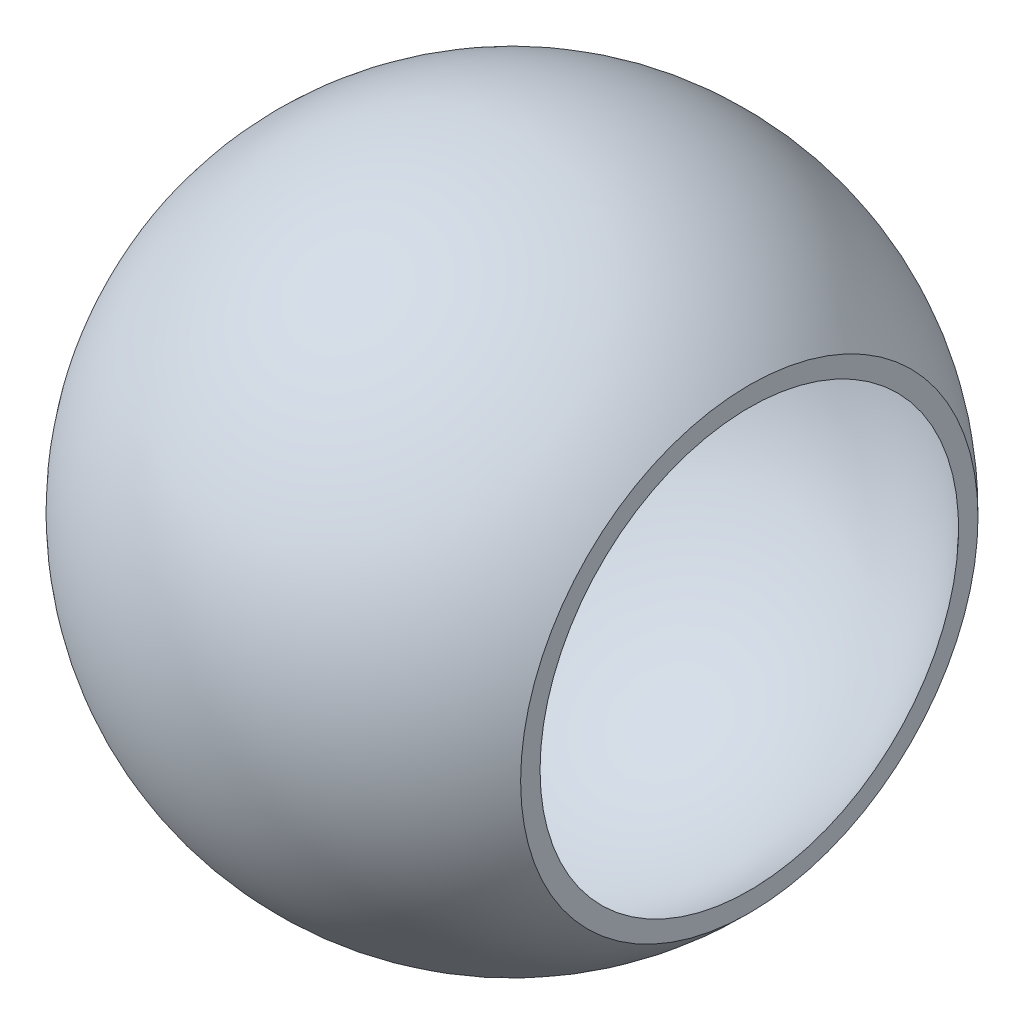
ISO-10303-21;
HEADER;
FILE_DESCRIPTION(('STEP AP214'),'2;1');
FILE_NAME('part.step','',(''),(''),'','','');
FILE_SCHEMA(('AUTOMOTIVE_DESIGN { 1 0 10303 214 1 1 1 1 }'));
ENDSEC;
DATA;
#1=APPLICATION_CONTEXT('core data for automotive mechanical design processes');
#2=APPLICATION_PROTOCOL_DEFINITION('international standard','automotive_design',2000,#1);
#3=PRODUCT_CONTEXT('',#1,'mechanical');
#4=PRODUCT('Part','Part','',(#3));
#5=PRODUCT_RELATED_PRODUCT_CATEGORY('part','',(#4));
#6=PRODUCT_DEFINITION_FORMATION('','',#4);
#7=PRODUCT_DEFINITION_CONTEXT('part definition',#1,'design');
#8=PRODUCT_DEFINITION('design','',#6,#7);
#9=PRODUCT_DEFINITION_SHAPE('','',#8);
#10=(LENGTH_UNIT() NAMED_UNIT(*) SI_UNIT(.MILLI.,.METRE.));
#11=(NAMED_UNIT(*) PLANE_ANGLE_UNIT() SI_UNIT($,.RADIAN.));
#12=(NAMED_UNIT(*) SI_UNIT($,.STERADIAN.) SOLID_ANGLE_UNIT());
#13=UNCERTAINTY_MEASURE_WITH_UNIT(LENGTH_MEASURE(1.E-05),#10,'distance_accuracy_value','');
#14=(GEOMETRIC_REPRESENTATION_CONTEXT(3) GLOBAL_UNCERTAINTY_ASSIGNED_CONTEXT((#13)) GLOBAL_UNIT_ASSIGNED_CONTEXT((#10,
#11,#12)) REPRESENTATION_CONTEXT('',''));
#15=CARTESIAN_POINT('',(0.,0.,0.));
#16=DIRECTION('',(0.,0.,1.));
#17=DIRECTION('',(1.,0.,0.));
#18=AXIS2_PLACEMENT_3D('',#15,#16,#17);
#19=CARTESIAN_POINT('',(0.,0.,0.));
#20=DIRECTION('',(-1.,0.,0.));
#21=DIRECTION('',(0.,1.,0.));
#22=AXIS2_PLACEMENT_3D('',#19,#20,#21);
#23=SPHERICAL_SURFACE('',#22,63.5);
#24=CARTESIAN_POINT('',(45.72,0.,0.));
#25=DIRECTION('',(-1.,0.,0.));
#26=DIRECTION('',(0.,0.,1.));
#27=AXIS2_PLACEMENT_3D('',#24,#25,#26);
#28=CIRCLE('',#27,44.0673529951596);
#29=CARTESIAN_POINT('',(45.72,0.,44.0673529951596));
#30=VERTEX_POINT('',#29);
#31=EDGE_CURVE('E53',#30,#30,#28,.T.);
#32=ORIENTED_EDGE('',*,*,#31,.T.);
#33=EDGE_LOOP('',(#32));
#34=FACE_BOUND('',#33,.T.);
#35=ADVANCED_FACE('F39',(#34),#23,.T.);
#36=CARTESIAN_POINT('',(0.,0.,0.));
#37=DIRECTION('',(-1.,0.,0.));
#38=DIRECTION('',(0.,-1.,0.));
#39=AXIS2_PLACEMENT_3D('',#36,#37,#38);
#40=SPHERICAL_SURFACE('',#39,60.96);
#41=CARTESIAN_POINT('',(-58.728190140881,-4.93898434507144,-15.5797213202183));
#42=CARTESIAN_POINT('',(-58.6528182963738,-4.4966754573948,-16.0040549296716));
#43=CARTESIAN_POINT('',(-58.5742697843132,-4.03657677956164,-16.40925446128));
#44=CARTESIAN_POINT('',(-58.4520807981522,-3.32240151822809,-16.9862572601403));
#45=CARTESIAN_POINT('',(-58.4106148542449,-3.08028861076684,-17.1734925460337));
#46=CARTESIAN_POINT('',(-58.32628118204,-2.5884197994369,-17.5374459140944));
#47=CARTESIAN_POINT('',(-58.2834130877995,-2.33866190143428,-17.7141612161949));
#48=CARTESIAN_POINT('',(-58.1527359418818,-1.57817812718941,-18.2283426617667));
#49=CARTESIAN_POINT('',(-58.0629242083482,-1.05665254945861,-18.5495129473025));
#50=CARTESIAN_POINT('',(-57.8785880623361,0.0111462221293164,-19.1460975265202));
#51=CARTESIAN_POINT('',(-57.7840636149989,0.557419599036524,-19.4215114816895));
#52=CARTESIAN_POINT('',(-57.639276249158,1.39202813836663,-19.7988183111399));
#53=CARTESIAN_POINT('',(-57.5905313673205,1.67266258825274,-19.9185823671034));
#54=CARTESIAN_POINT('',(-57.4921146604404,2.23853525867258,-20.1460343745699));
#55=CARTESIAN_POINT('',(-57.4424430782538,2.52377227045958,-20.2537254395391));
#56=CARTESIAN_POINT('',(-57.2921293973907,3.38580169622216,-20.5584838657334));
#57=CARTESIAN_POINT('',(-57.1901811794083,3.96895392963793,-20.7372551749259));
#58=CARTESIAN_POINT('',(-56.9835614337155,5.14758571965184,-21.0446978971691));
#59=CARTESIAN_POINT('',(-56.8788906565427,5.74306186981372,-21.1733829647383));
#60=CARTESIAN_POINT('',(-56.6674764619842,6.94241579788491,-21.3799667333892));
#61=CARTESIAN_POINT('',(-56.5607330397027,7.54629359563873,-21.4578653144935));
#62=CARTESIAN_POINT('',(-56.3449293454466,8.76365167910235,-21.5628682604463));
#63=CARTESIAN_POINT('',(-56.2358568884176,9.37716953595424,-21.5895118202819));
#64=CARTESIAN_POINT('',(-56.0170829974925,10.604137621031,-21.5904748781317));
#65=CARTESIAN_POINT('',(-55.907381559269,11.2175878487608,-21.5647940157264));
#66=CARTESIAN_POINT('',(-55.6881087299891,12.4401517226684,-21.4612946453791));
#67=CARTESIAN_POINT('',(-55.578537350657,13.0492649994568,-21.3834717488039));
#68=CARTESIAN_POINT('',(-55.3603147985226,14.2588137324008,-21.1762077589465));
#69=CARTESIAN_POINT('',(-55.2516636270113,14.8592491763843,-21.0467665932689));
#70=CARTESIAN_POINT('',(-55.035556357851,16.0500432442954,-20.7363778420206));
#71=CARTESIAN_POINT('',(-54.9281084575108,16.6403399653918,-20.5551869603974));
#72=CARTESIAN_POINT('',(-54.7157480471038,17.8036566432319,-20.1427519115771));
#73=CARTESIAN_POINT('',(-54.6108355494356,18.3766765154909,-19.911507499661));
#74=CARTESIAN_POINT('',(-54.4043568806422,19.5012874936897,-19.4005016318034));
#75=CARTESIAN_POINT('',(-54.3027906980702,20.052878672932,-19.1207403418448));
#76=CARTESIAN_POINT('',(-54.1038113721715,21.1305933541107,-18.5145709945743));
#77=CARTESIAN_POINT('',(-54.0063982027806,21.6567170158828,-18.1881632300694));
#78=CARTESIAN_POINT('',(-53.8170388544708,22.6768058179892,-17.4928062902152));
#79=CARTESIAN_POINT('',(-53.7250657821793,23.1709305452257,-17.1240985737144));
#80=CARTESIAN_POINT('',(-53.5467819855401,24.1264461371413,-16.3452192483168));
#81=CARTESIAN_POINT('',(-53.4604712531775,24.5878370481546,-15.9350476981135));
#82=CARTESIAN_POINT('',(-53.2942588038089,25.474361718277,-15.0760836119699));
#83=CARTESIAN_POINT('',(-53.2143567461874,25.8994974043969,-14.6272931312248));
#84=CARTESIAN_POINT('',(-53.0616651384054,26.7102542702174,-13.694211086087));
#85=CARTESIAN_POINT('',(-52.9888755038418,27.095875918834,-13.2099199431003));
#86=CARTESIAN_POINT('',(-52.8520610412131,27.8193480913231,-12.216460110385));
#87=CARTESIAN_POINT('',(-52.787925502129,28.1578043106887,-11.7077477047672));
#88=CARTESIAN_POINT('',(-52.6677933227662,28.7907547387331,-10.6627549566997));
#89=CARTESIAN_POINT('',(-52.6117966153299,29.0852493101625,-10.1264748417748));
#90=CARTESIAN_POINT('',(-52.5084691753342,29.6279274539928,-9.03022096838446));
#91=CARTESIAN_POINT('',(-52.4611377707602,29.8761146176702,-8.47024905142386));
#92=CARTESIAN_POINT('',(-52.3755880483721,30.3242118985853,-7.33063721716392));
#93=CARTESIAN_POINT('',(-52.3373696255594,30.5241225720578,-6.75099752656166));
#94=CARTESIAN_POINT('',(-52.270981345091,30.8710955253414,-5.586206706759));
#95=CARTESIAN_POINT('',(-52.2426531626632,31.0189907915012,-5.00131261089961));
#96=CARTESIAN_POINT('',(-52.1954351257993,31.2653717354644,-3.82083561213719));
#97=CARTESIAN_POINT('',(-52.1765451620005,31.3638579857811,-3.22525283316918));
#98=CARTESIAN_POINT('',(-52.148386666874,31.5106281532685,-2.02774551559401));
#99=CARTESIAN_POINT('',(-52.1391175352259,31.5589152027679,-1.42582137504279));
#100=CARTESIAN_POINT('',(-52.1302887508812,31.6049088857854,-0.219973042487498));
#101=CARTESIAN_POINT('',(-52.1307290525102,31.6026157572393,0.383951140094754));
#102=CARTESIAN_POINT('',(-52.1412581162309,31.5477630283714,1.5829734247542));
#103=CARTESIAN_POINT('',(-52.1512440503049,31.4957391405445,2.17809701680885));
#104=CARTESIAN_POINT('',(-52.1806198737757,31.3426137406545,3.36175652940893));
#105=CARTESIAN_POINT('',(-52.2000096807588,31.2415126586939,3.95029250764062));
#106=CARTESIAN_POINT('',(-52.2480097524098,30.9910272991496,5.11660370241087));
#107=CARTESIAN_POINT('',(-52.2766198918135,30.8416436775152,5.69437906502654));
#108=CARTESIAN_POINT('',(-52.3427935086863,30.495754169723,6.83512072841002));
#109=CARTESIAN_POINT('',(-52.3803570222833,30.2992480934205,7.39808696941106));
#110=CARTESIAN_POINT('',(-52.4641428608523,29.860357488685,8.50597229211439));
#111=CARTESIAN_POINT('',(-52.5103757122128,29.6179171827295,9.05086847631357));
#112=CARTESIAN_POINT('',(-52.611051275857,29.0891609139157,10.1181421751086));
#113=CARTESIAN_POINT('',(-52.6654939778653,28.8028450059713,10.6405197178874));
#114=CARTESIAN_POINT('',(-52.7821090163634,28.1884729376764,11.6592359269179));
#115=CARTESIAN_POINT('',(-52.8442816261707,27.8604153013931,12.1555736715596));
#116=CARTESIAN_POINT('',(-52.9758175873357,27.1649862306813,13.1188835666034));
#117=CARTESIAN_POINT('',(-53.0451810084709,26.7976144147588,13.5858554319771));
#118=CARTESIAN_POINT('',(-53.1914050261437,26.0214935505126,14.4928923118229));
#119=CARTESIAN_POINT('',(-53.2683470322442,25.6122928826102,14.9325577878226));
#120=CARTESIAN_POINT('',(-53.4283550896214,24.7593243724081,15.7757526743203));
#121=CARTESIAN_POINT('',(-53.5114211807982,24.3155563048912,16.1792818493425));
#122=CARTESIAN_POINT('',(-53.6830061309133,23.3966070598015,16.9476048195892));
#123=CARTESIAN_POINT('',(-53.7715253376548,22.9214238784112,17.3123961400391));
#124=CARTESIAN_POINT('',(-53.9533119018055,21.9430209629137,18.000879420522));
#125=CARTESIAN_POINT('',(-54.0465793085171,21.4398009376843,18.3245709536789));
#126=CARTESIAN_POINT('',(-54.2387489959632,20.4001483891559,18.9338887219133));
#127=CARTESIAN_POINT('',(-54.3377196455953,19.8632997499459,19.2187835764796));
#128=CARTESIAN_POINT('',(-54.5390663691604,18.7680328908478,19.7421199743956));
#129=CARTESIAN_POINT('',(-54.6414424792789,18.2096144417547,19.9805610239553));
#130=CARTESIAN_POINT('',(-54.8488382548947,17.0750855810229,20.4094720170748));
#131=CARTESIAN_POINT('',(-54.9538580852275,16.4989740657289,20.5999389612669));
#132=CARTESIAN_POINT('',(-55.1657675621631,15.3330905232547,20.931664803646));
#133=CARTESIAN_POINT('',(-55.2726572210716,14.743318406162,21.0729233778517));
#134=CARTESIAN_POINT('',(-55.4889764939179,13.5462497683229,21.3068748312937));
#135=CARTESIAN_POINT('',(-55.5984209735039,12.9388244499593,21.3988954248924));
#136=CARTESIAN_POINT('',(-55.8176620881941,11.7184027132849,21.5308609664015));
#137=CARTESIAN_POINT('',(-55.927458726697,11.105406241104,21.5708054102223));
#138=CARTESIAN_POINT('',(-56.1466348427712,9.87814080369495,21.5983352344682));
#139=CARTESIAN_POINT('',(-56.2560143056421,9.26387179478114,21.5859187865668));
#140=CARTESIAN_POINT('',(-56.4735944492506,8.03841699109746,21.5087736098792));
#141=CARTESIAN_POINT('',(-56.5817951299005,7.42723119655719,21.4440448771974));
#142=CARTESIAN_POINT('',(-56.7967355218503,6.20968021336516,21.2622759835897));
#143=CARTESIAN_POINT('',(-56.9034670472611,5.60334664606149,21.1450141815609));
#144=CARTESIAN_POINT('',(-57.1142675297508,4.40250972741522,20.8588599274565));
#145=CARTESIAN_POINT('',(-57.2183364744351,3.80800643114624,20.6899672350828));
#146=CARTESIAN_POINT('',(-57.4231055007186,2.63514709461023,20.30164110737));
#147=CARTESIAN_POINT('',(-57.5238056119498,2.05679091232086,20.0822081167164));
#148=CARTESIAN_POINT('',(-57.7211584159941,0.920458809027246,19.5942414510344));
#149=CARTESIAN_POINT('',(-57.8178111347852,0.362482757216711,19.3257080912145));
#150=CARTESIAN_POINT('',(-58.0058693310626,-0.725774788582676,18.7430386115303));
#151=CARTESIAN_POINT('',(-58.0973021017278,-1.25619870938988,18.4291773277643));
#152=CARTESIAN_POINT('',(-58.2749170054021,-2.28888574819522,17.7568060950709));
#153=CARTESIAN_POINT('',(-58.3610991487502,-2.79114892164407,17.3982962340647));
#154=CARTESIAN_POINT('',(-58.5276349201492,-3.76371740969461,16.6390946052607));
#155=CARTESIAN_POINT('',(-58.6079887972482,-4.23402408977759,16.2384046416602));
#156=CARTESIAN_POINT('',(-58.7623345303826,-5.13911649794536,15.3976165604476));
#157=CARTESIAN_POINT('',(-58.8363264499676,-5.57390258084273,14.9575188365687));
#158=CARTESIAN_POINT('',(-58.9765585263671,-6.39933862212131,14.0468272246593));
#159=CARTESIAN_POINT('',(-59.042884910997,-6.79047737419401,13.5766895980361));
#160=CARTESIAN_POINT('',(-59.1684155347944,-7.531870692223,12.6043186481459));
#161=CARTESIAN_POINT('',(-59.2276198261607,-7.88212555782263,12.1020855601525));
#162=CARTESIAN_POINT('',(-59.3385115043243,-8.53902605789878,11.0691181404891));
#163=CARTESIAN_POINT('',(-59.3901993283027,-8.84567422865316,10.538385468904));
#164=CARTESIAN_POINT('',(-59.4857181371666,-9.41298724377835,9.45221051994335));
#165=CARTESIAN_POINT('',(-59.5295491941537,-9.67365251013394,8.89676846938414));
#166=CARTESIAN_POINT('',(-59.6085103439147,-10.1436613107121,7.77306400369083));
#167=CARTESIAN_POINT('',(-59.6437526014671,-10.3536660276736,7.20508593883696));
#168=CARTESIAN_POINT('',(-59.7060817474323,-10.7253321352769,6.05309181469801));
#169=CARTESIAN_POINT('',(-59.7331687102726,-10.886993967109,5.46907590183177));
#170=CARTESIAN_POINT('',(-59.7790076697725,-11.1607015856488,4.28926502889863));
#171=CARTESIAN_POINT('',(-59.797760421903,-11.2727518694903,3.69347114158545));
#172=CARTESIAN_POINT('',(-59.8268111311396,-11.4463787961543,2.49437036894335));
#173=CARTESIAN_POINT('',(-59.8371091371822,-11.50795573112,1.89106352712044));
#174=CARTESIAN_POINT('',(-59.8491239868296,-11.5798017823965,0.687208788001936));
#175=CARTESIAN_POINT('',(-59.8509232682958,-11.5905638043839,0.0866910752657398));
#176=CARTESIAN_POINT('',(-59.8461527919581,-11.5620348787982,-1.11312024880146));
#177=CARTESIAN_POINT('',(-59.8395830625627,-11.5227441011287,-1.71241386428072));
#178=CARTESIAN_POINT('',(-59.818114487472,-11.3943976591759,-2.90564102904018));
#179=CARTESIAN_POINT('',(-59.8032136560189,-11.3053301303704,-3.49957326610149));
#180=CARTESIAN_POINT('',(-59.7651780685889,-11.0781101689234,-4.67769405074414));
#181=CARTESIAN_POINT('',(-59.7420434390793,-10.939958490192,-5.26188274783753));
#182=CARTESIAN_POINT('',(-59.6877276511806,-10.6158588793143,-6.41557055250746));
#183=CARTESIAN_POINT('',(-59.6565578934833,-10.429978668554,-6.98508922559731));
#184=CARTESIAN_POINT('',(-59.5863538824398,-10.0117300767609,-8.10633001767806));
#185=CARTESIAN_POINT('',(-59.5473191108458,-9.77935863229801,-8.65805096114626));
#186=CARTESIAN_POINT('',(-59.4616818137095,-9.27016547977602,-9.73922412380213));
#187=CARTESIAN_POINT('',(-59.4150877615009,-8.99339354486577,-10.2687004503106));
#188=CARTESIAN_POINT('',(-59.3146140948678,-8.39738625829808,-11.3022307986331));
#189=CARTESIAN_POINT('',(-59.2607364200778,-8.07816221203939,-11.806291539739));
#190=CARTESIAN_POINT('',(-59.1339226699369,-7.3279522431005,-12.8890231560156));
#191=CARTESIAN_POINT('',(-59.0593627729462,-6.88758932906139,-13.4610402143705));
#192=CARTESIAN_POINT('',(-58.9007236398063,-5.95264597870499,-14.5573960506316));
#193=CARTESIAN_POINT('',(-58.8166444583123,-5.45806585367771,-15.0817351022512));
#194=CARTESIAN_POINT('',(-58.728190140881,-4.93898434507144,-15.5797213202183));
#195=B_SPLINE_CURVE_WITH_KNOTS('',3,(#41,#42,#43,#44,#45,#46,#47,#48,#49,#50,#51,#52,#53,#54,
#55,#56,#57,#58,#59,#60,#61,#62,#63,#64,#65,#66,#67,#68,#69,#70,#71,#72,#73,#74,#75,#76,#77,#78,
#79,#80,#81,#82,#83,#84,#85,#86,#87,#88,#89,#90,#91,#92,#93,#94,#95,#96,#97,#98,#99,#100,#101,
#102,#103,#104,#105,#106,#107,#108,#109,#110,#111,#112,#113,#114,#115,#116,#117,#118,#119,#120,
#121,#122,#123,#124,#125,#126,#127,#128,#129,#130,#131,#132,#133,#134,#135,#136,#137,#138,#139,
#140,#141,#142,#143,#144,#145,#146,#147,#148,#149,#150,#151,#152,#153,#154,#155,#156,#157,#158,
#159,#160,#161,#162,#163,#164,#165,#166,#167,#168,#169,#170,#171,#172,#173,#174,#175,#176,#177,
#178,#179,#180,#181,#182,#183,#184,#185,#186,#187,#188,#189,#190,#191,#192,#193,#194),
.UNSPECIFIED.,.T.,.F.,(4,2,2,2,2,2,2,2,2,2,2,2,2,2,2,2,2,2,2,2,2,2,2,2,2,2,2,2,2,2,2,2,2,2,2,2,
2,2,2,2,2,2,2,2,2,2,2,2,2,2,2,2,2,2,2,2,2,2,2,2,2,2,2,2,2,2,2,2,2,2,2,2,2,2,2,2,4),(0.,
1.85195013431787,2.77828938663337,3.70487236139712,5.55962947000042,7.41440029977868,
8.34113338852035,9.26762693248919,11.1204763832593,12.9728203555421,14.8251687037661,
16.6940940401652,18.5630322500847,20.4321277824996,22.30122593636,24.1792603459161,
26.0573039376653,27.9353411044977,29.8133664831269,31.6811601664215,33.5489512058247,
35.4166429078273,37.2843124432215,39.1252018815321,40.9660761288581,42.8068075515423,
44.6475177645668,46.457241945316,48.2669451558986,50.0765354378759,51.8861172073031,
53.6764228136997,55.4667127305061,57.2569783260952,59.0472511457437,60.839711974279,
62.6321705594206,64.4246925411676,66.2172319186289,68.0317231057267,69.846226115777,
71.6608449760304,73.475482681989,75.3206257586563,77.1657884475704,79.0110664684653,
80.8563566381957,82.726237644297,84.5961367504386,86.466101149863,88.3360656885365,
90.2139951594253,92.0919333706184,93.9698550591527,95.8477646924576,97.7147320911116,
99.5816958134313,101.448579711309,103.315444958743,105.158691697453,107.001924925918,
108.845050903295,110.688159965439,112.505726159806,114.323275766066,116.140660583316,
117.958034881346,119.757743888857,121.557446787295,123.357578836431,125.157683237558,
126.955247473826,128.752930195375,130.548611610293,132.343815772336,134.517225838298,
136.690623426203),.UNSPECIFIED.);
#196=CARTESIAN_POINT('',(-58.728190140881,-4.93898434507144,-15.5797213202183));
#197=VERTEX_POINT('',#196);
#198=EDGE_CURVE('E57',#197,#197,#195,.T.);
#199=ORIENTED_EDGE('',*,*,#198,.F.);
#200=EDGE_LOOP('',(#199));
#201=FACE_BOUND('',#200,.T.);
#202=CARTESIAN_POINT('',(45.72,0.,0.));
#203=DIRECTION('',(-1.,0.,0.));
#204=DIRECTION('',(0.,0.,1.));
#205=AXIS2_PLACEMENT_3D('',#202,#203,#204);
#206=CIRCLE('',#205,40.3212499806244);
#207=CARTESIAN_POINT('',(45.72,0.,40.3212499806244));
#208=VERTEX_POINT('',#207);
#209=EDGE_CURVE('E49',#208,#208,#206,.T.);
#210=ORIENTED_EDGE('',*,*,#209,.F.);
#211=EDGE_LOOP('',(#210));
#212=FACE_BOUND('',#211,.T.);
#213=ADVANCED_FACE('F77',(#201,#212),#40,.F.);
#214=CARTESIAN_POINT('',(45.72,44.0673529951596,0.));
#215=DIRECTION('',(-1.,0.,0.));
#216=DIRECTION('',(0.,0.,1.));
#217=AXIS2_PLACEMENT_3D('',#214,#215,#216);
#218=PLANE('',#217);
#219=ORIENTED_EDGE('',*,*,#31,.F.);
#220=EDGE_LOOP('',(#219));
#221=FACE_BOUND('',#220,.T.);
#222=ORIENTED_EDGE('',*,*,#209,.T.);
#223=EDGE_LOOP('',(#222));
#224=FACE_BOUND('',#223,.T.);
#225=ADVANCED_FACE('F74',(#221,#224),#218,.F.);
#226=CARTESIAN_POINT('',(-38.1,10.0076,0.));
#227=DIRECTION('',(1.,0.,0.));
#228=DIRECTION('',(0.,0.,-1.));
#229=AXIS2_PLACEMENT_3D('',#226,#227,#228);
#230=PLANE('',#229);
#231=CARTESIAN_POINT('',(-38.1,10.0076,0.));
#232=DIRECTION('',(1.,0.,0.));
#233=DIRECTION('',(0.,0.,-1.));
#234=AXIS2_PLACEMENT_3D('',#231,#232,#233);
#235=CIRCLE('',#234,17.145);
#236=CARTESIAN_POINT('',(-38.1,10.0076,-17.145));
#237=VERTEX_POINT('',#236);
#238=EDGE_CURVE('E67',#237,#237,#235,.T.);
#239=ORIENTED_EDGE('',*,*,#238,.F.);
#240=EDGE_LOOP('',(#239));
#241=FACE_BOUND('',#240,.T.);
#242=CARTESIAN_POINT('',(-38.1,10.0076,0.));
#243=DIRECTION('',(1.,0.,0.));
#244=DIRECTION('',(0.,0.,-1.));
#245=AXIS2_PLACEMENT_3D('',#242,#243,#244);
#246=CIRCLE('',#245,21.59);
#247=CARTESIAN_POINT('',(-38.1,10.0076,-21.59));
#248=VERTEX_POINT('',#247);
#249=EDGE_CURVE('E68',#248,#248,#246,.T.);
#250=ORIENTED_EDGE('',*,*,#249,.T.);
#251=EDGE_LOOP('',(#250));
#252=FACE_BOUND('',#251,.T.);
#253=ADVANCED_FACE('F76',(#241,#252),#230,.T.);
#254=CARTESIAN_POINT('',(-63.502,10.0076,0.));
#255=DIRECTION('',(1.,0.,0.));
#256=DIRECTION('',(0.,0.,-1.));
#257=AXIS2_PLACEMENT_3D('',#254,#255,#256);
#258=CYLINDRICAL_SURFACE('',#257,21.59);
#259=ORIENTED_EDGE('',*,*,#249,.F.);
#260=EDGE_LOOP('',(#259));
#261=FACE_BOUND('',#260,.T.);
#262=ORIENTED_EDGE('',*,*,#198,.T.);
#263=EDGE_LOOP('',(#262));
#264=FACE_BOUND('',#263,.T.);
#265=ADVANCED_FACE('F70',(#261,#264),#258,.T.);
#266=CARTESIAN_POINT('',(-63.502,10.0076,0.));
#267=DIRECTION('',(1.,0.,0.));
#268=DIRECTION('',(0.,0.,-1.));
#269=AXIS2_PLACEMENT_3D('',#266,#267,#268);
#270=CYLINDRICAL_SURFACE('',#269,17.145);
#271=ORIENTED_EDGE('',*,*,#238,.T.);
#272=EDGE_LOOP('',(#271));
#273=FACE_BOUND('',#272,.T.);
#274=CARTESIAN_POINT('',(-59.6363383009227,-1.70721317709017,-12.5185533200076));
#275=CARTESIAN_POINT('',(-59.6948166549442,-2.05569162235445,-12.192455460484));
#276=CARTESIAN_POINT('',(-59.7509483577866,-2.39069916803051,-11.851647771578));
#277=CARTESIAN_POINT('',(-59.8581875859623,-3.03155167516224,-11.1427035907715));
#278=CARTESIAN_POINT('',(-59.9092939626295,-3.33738996876474,-10.7745608843516));
#279=CARTESIAN_POINT('',(-60.0061703310919,-3.91779723231146,-10.0131778616549));
#280=CARTESIAN_POINT('',(-60.0519350984164,-4.19233558271265,-9.61991354667185));
#281=CARTESIAN_POINT('',(-60.1377649047277,-4.70773675740889,-8.811340493646));
#282=CARTESIAN_POINT('',(-60.1778302747558,-4.94860153757125,-8.39603303787316));
#283=CARTESIAN_POINT('',(-60.251997174235,-5.39485764229233,-7.54623508187241));
#284=CARTESIAN_POINT('',(-60.2860983597661,-5.60024692117636,-7.11174347721419));
#285=CARTESIAN_POINT('',(-60.348104300687,-5.97396468989424,-6.22666625057317));
#286=CARTESIAN_POINT('',(-60.3760089621359,-6.14229261786844,-5.77608038471755));
#287=CARTESIAN_POINT('',(-60.4254257001276,-6.44054654906915,-4.86214984798291));
#288=CARTESIAN_POINT('',(-60.4469393001067,-6.57048170393531,-4.39880824650666));
#289=CARTESIAN_POINT('',(-60.4834359595607,-6.79099181114777,-3.46260161862743));
#290=CARTESIAN_POINT('',(-60.4984190818234,-6.88156714192238,-2.98973668383307));
#291=CARTESIAN_POINT('',(-60.5216638691836,-7.0221147204313,-2.04152225463421));
#292=CARTESIAN_POINT('',(-60.5299757142602,-7.07239009241196,-1.56621889946973));
#293=CARTESIAN_POINT('',(-60.5400109045098,-7.13309196181491,-0.613005674441278));
#294=CARTESIAN_POINT('',(-60.5417342770995,-7.14351862506058,-0.135095815432093));
#295=CARTESIAN_POINT('',(-60.5385808915015,-7.12444248169208,0.819905663823177));
#296=CARTESIAN_POINT('',(-60.5337041099008,-7.09493953343379,1.29699728116066));
#297=CARTESIAN_POINT('',(-60.5173833486206,-6.99623227210768,2.24694152505047));
#298=CARTESIAN_POINT('',(-60.5059393781183,-6.9270280145193,2.7197941575255));
#299=CARTESIAN_POINT('',(-60.4766207291228,-6.74981056455048,3.6559912886393));
#300=CARTESIAN_POINT('',(-60.4587721141538,-6.64195466624232,4.11936639222246));
#301=CARTESIAN_POINT('',(-60.4167564301329,-6.38821415084002,5.03528814757345));
#302=CARTESIAN_POINT('',(-60.3925893858247,-6.24232968266965,5.48783484173886));
#303=CARTESIAN_POINT('',(-60.3380975145891,-5.9136374924213,6.37892978019378));
#304=CARTESIAN_POINT('',(-60.3077726841294,-5.73082974916304,6.8174780164532));
#305=CARTESIAN_POINT('',(-60.2411658285144,-5.32966541151973,7.67753044440477));
#306=CARTESIAN_POINT('',(-60.2048837753103,-5.11130864975644,8.09903455583506));
#307=CARTESIAN_POINT('',(-60.1264314691152,-4.63965305411536,8.92388298585087));
#308=CARTESIAN_POINT('',(-60.0842363901879,-4.38620695406074,9.32714072957041));
#309=CARTESIAN_POINT('',(-59.994356312083,-3.84698317925371,10.1107746647324));
#310=CARTESIAN_POINT('',(-59.9466713055175,-3.56120546099232,10.4911508253817));
#311=CARTESIAN_POINT('',(-59.8461220450151,-2.95940906405551,11.2264606338123));
#312=CARTESIAN_POINT('',(-59.7932576257213,-2.64338941988942,11.5813934686676));
#313=CARTESIAN_POINT('',(-59.6826946309432,-1.98341012727573,12.263437382433));
#314=CARTESIAN_POINT('',(-59.6249960170997,-1.63945025712338,12.5905482405344));
#315=CARTESIAN_POINT('',(-59.5044778531566,-0.922128271955932,13.2182331791378));
#316=CARTESIAN_POINT('',(-59.4416089470385,-0.548484310279066,13.5184757111543));
#317=CARTESIAN_POINT('',(-59.3117243906205,0.222141137087984,14.0863376613949));
#318=CARTESIAN_POINT('',(-59.2447087147513,0.619122766679454,14.3539568784307));
#319=CARTESIAN_POINT('',(-59.1069653439347,1.4336116188489,14.8548419508521));
#320=CARTESIAN_POINT('',(-59.0362374519905,1.85111993064577,15.0881059805992));
#321=CARTESIAN_POINT('',(-58.8915338371287,2.70370065132434,15.5187685454065));
#322=CARTESIAN_POINT('',(-58.8175580874657,3.13877320484147,15.7161667850509));
#323=CARTESIAN_POINT('',(-58.6658200564198,4.02943875286957,16.0762700476838));
#324=CARTESIAN_POINT('',(-58.5880200918545,4.48522971219494,16.2384696818832));
#325=CARTESIAN_POINT('',(-58.4300984026303,5.40851291979157,16.5237066919109));
#326=CARTESIAN_POINT('',(-58.3499766577987,5.87600526972463,16.6467437273666));
#327=CARTESIAN_POINT('',(-58.1879444025826,6.81943334603446,16.8528860210096));
#328=CARTESIAN_POINT('',(-58.1060337986281,7.29536951383676,16.9359891851195));
#329=CARTESIAN_POINT('',(-57.9409795632383,8.25234474417721,17.0617411971457));
#330=CARTESIAN_POINT('',(-57.8578359251732,8.73338383414899,17.1043898274644));
#331=CARTESIAN_POINT('',(-57.6899866318827,9.70238583454274,17.1492162065389));
#332=CARTESIAN_POINT('',(-57.6052737801485,10.1903677874041,17.1509564240875));
#333=CARTESIAN_POINT('',(-57.4357577212328,11.1646924204052,17.1128564785009));
#334=CARTESIAN_POINT('',(-57.3509545133372,11.6510350874612,17.0730159842759));
#335=CARTESIAN_POINT('',(-57.1818569019122,12.6186609525218,16.9520242573743));
#336=CARTESIAN_POINT('',(-57.0975625144845,13.0999439907673,16.8708717242327));
#337=CARTESIAN_POINT('',(-56.9300926881318,14.0540284910718,16.667792939891));
#338=CARTESIAN_POINT('',(-56.846917248911,14.5268299553724,16.5458666994672));
#339=CARTESIAN_POINT('',(-56.6820439625006,15.4620159557938,16.2616094216838));
#340=CARTESIAN_POINT('',(-56.6003513964699,15.9243643169306,16.0991562686537));
#341=CARTESIAN_POINT('',(-56.4393207572844,16.8338157266387,15.7351107970288));
#342=CARTESIAN_POINT('',(-56.3599826932715,17.2809187160176,15.5335183264904));
#343=CARTESIAN_POINT('',(-56.2042730887957,18.1566200362642,15.0925419393993));
#344=CARTESIAN_POINT('',(-56.1279015200709,18.5852185434283,14.8531583829923));
#345=CARTESIAN_POINT('',(-55.9787268701176,19.4207569659151,14.3382118584416));
#346=CARTESIAN_POINT('',(-55.9059237639832,19.8276970324018,14.0626491428553));
#347=CARTESIAN_POINT('',(-55.7649491715088,20.6142338270099,13.479187710124));
#348=CARTESIAN_POINT('',(-55.6967498978386,20.9939956293159,13.171518246894));
#349=CARTESIAN_POINT('',(-55.5650108837957,21.7263149050505,12.52443582417));
#350=CARTESIAN_POINT('',(-55.5014711319097,22.0788724456986,12.1850229431162));
#351=CARTESIAN_POINT('',(-55.3795881198042,22.7540852628874,11.476824032947));
#352=CARTESIAN_POINT('',(-55.3212445834472,23.0767421284486,11.1080395666736));
#353=CARTESIAN_POINT('',(-55.2102530266889,23.6896795687427,10.3436791921556));
#354=CARTESIAN_POINT('',(-55.1576049419897,23.9799605089796,9.9481035864473));
#355=CARTESIAN_POINT('',(-55.0591713933354,24.5219966472685,9.13877187571226));
#356=CARTESIAN_POINT('',(-55.0132992394723,24.7742395698846,8.72535291255026));
#357=CARTESIAN_POINT('',(-54.9279431427985,25.2430911209829,7.87814834496254));
#358=CARTESIAN_POINT('',(-54.8884591460005,25.4597000506142,7.44436291269719));
#359=CARTESIAN_POINT('',(-54.8162350474786,25.8555654215044,6.55956515917539));
#360=CARTESIAN_POINT('',(-54.7834944599566,26.0348245534699,6.10855408163878));
#361=CARTESIAN_POINT('',(-54.7250518150233,26.3545800937081,5.19255088481413));
#362=CARTESIAN_POINT('',(-54.6993496879342,26.4950768857117,4.72755890398173));
#363=CARTESIAN_POINT('',(-54.6555555656577,26.734349453192,3.79413826347235));
#364=CARTESIAN_POINT('',(-54.6373541616994,26.8337251343535,3.32586843277585));
#365=CARTESIAN_POINT('',(-54.6081727889126,26.9930008620993,2.3824421571732));
#366=CARTESIAN_POINT('',(-54.5971927434173,27.0529013277796,1.90728578543402));
#367=CARTESIAN_POINT('',(-54.5825545415845,27.1327504224682,0.953540526036681));
#368=CARTESIAN_POINT('',(-54.5788960087901,27.1527011056117,0.474951816132195));
#369=CARTESIAN_POINT('',(-54.578933228387,27.1524981248355,-0.482216521991722));
#370=CARTESIAN_POINT('',(-54.5826289567647,27.1323445918662,-0.960796150235705));
#371=CARTESIAN_POINT('',(-54.5972778357093,27.0524370700234,-1.91040667211728));
#372=CARTESIAN_POINT('',(-54.6081687795621,26.9930225140267,-2.38146713187561));
#373=CARTESIAN_POINT('',(-54.6370486004099,26.8353931562665,-3.31682612437779));
#374=CARTESIAN_POINT('',(-54.6550374256264,26.737178637546,-3.78112470642345));
#375=CARTESIAN_POINT('',(-54.6979526442946,26.5027113912264,-4.69968141634434));
#376=CARTESIAN_POINT('',(-54.7228789785551,26.366458988168,-5.15393962984867));
#377=CARTESIAN_POINT('',(-54.7794497996924,26.056962291311,-6.04924266360459));
#378=CARTESIAN_POINT('',(-54.8110943162115,25.8837178342939,-6.49028742554519));
#379=CARTESIAN_POINT('',(-54.8809101805402,25.5010967198236,-7.35714497225937));
#380=CARTESIAN_POINT('',(-54.9190969673982,25.2916345814967,-7.7829187770695));
#381=CARTESIAN_POINT('',(-55.0016170757928,24.8384454396945,-8.61519395913471));
#382=CARTESIAN_POINT('',(-55.0459503955024,24.5947184464042,-9.02169534211832));
#383=CARTESIAN_POINT('',(-55.1403924457024,24.0748022758569,-9.81268821419088));
#384=CARTESIAN_POINT('',(-55.1905013923127,23.7986118838345,-10.1971788788478));
#385=CARTESIAN_POINT('',(-55.2960809640146,23.2157984208933,-10.9415709167573));
#386=CARTESIAN_POINT('',(-55.351551638261,22.9091750709741,-11.3014720645292));
#387=CARTESIAN_POINT('',(-55.4681005730066,22.2638737935008,-11.9984586694644));
#388=CARTESIAN_POINT('',(-55.5292378816045,21.9248568382763,-12.3352203866141));
#389=CARTESIAN_POINT('',(-55.6560544047863,21.2203855333906,-12.9789108425033));
#390=CARTESIAN_POINT('',(-55.721733648931,20.8549310116615,-13.2858393870442));
#391=CARTESIAN_POINT('',(-55.8571230431994,20.1001748657943,-13.8678793609302));
#392=CARTESIAN_POINT('',(-55.9268334428368,19.7108717654279,-14.1429888176218));
#393=CARTESIAN_POINT('',(-56.0697483081694,18.9111806530652,-14.6596003555157));
#394=CARTESIAN_POINT('',(-56.1429528070128,18.500792441034,-14.9011021178007));
#395=CARTESIAN_POINT('',(-56.2934718011358,17.6552528068666,-15.3524475783364));
#396=CARTESIAN_POINT('',(-56.3708325137815,17.2198154976559,-15.5617404280297));
#397=CARTESIAN_POINT('',(-56.5280123784607,16.3332180229201,-15.9427221696612));
#398=CARTESIAN_POINT('',(-56.6078315553462,15.8820576984488,-16.1144106813242));
#399=CARTESIAN_POINT('',(-56.7693428604947,14.9671682028652,-16.4190794906452));
#400=CARTESIAN_POINT('',(-56.8510350255628,14.503438784731,-16.5520590269476));
#401=CARTESIAN_POINT('',(-57.0157021094967,13.5666455826119,-16.7784515876353));
#402=CARTESIAN_POINT('',(-57.0986770345754,13.093581753414,-16.8718644203218));
#403=CARTESIAN_POINT('',(-57.2663109814278,12.1357451603514,-17.0193883242619));
#404=CARTESIAN_POINT('',(-57.3509783124257,11.6509000819964,-17.0730211761933));
#405=CARTESIAN_POINT('',(-57.5204206626328,10.6784353370079,-17.1388024709541));
#406=CARTESIAN_POINT('',(-57.6051956831825,10.1908156355708,-17.1509503922608));
#407=CARTESIAN_POINT('',(-57.774294599487,9.21602899295915,-17.1336526200961));
#408=CARTESIAN_POINT('',(-57.8586183624051,8.72886221660571,-17.1041952898392));
#409=CARTESIAN_POINT('',(-57.984272725097,8.00134436668877,-17.0289593529576));
#410=CARTESIAN_POINT('',(-58.0260205393663,7.75936798450335,-16.9987039739786));
#411=CARTESIAN_POINT('',(-58.1091874626732,7.2768043586337,-16.9278841774154));
#412=CARTESIAN_POINT('',(-58.1506064836392,7.03621749155832,-16.8873170878104));
#413=CARTESIAN_POINT('',(-58.274545390607,6.3155416317661,-16.7499084292771));
#414=CARTESIAN_POINT('',(-58.356456058967,5.83822275725811,-16.637533596802));
#415=CARTESIAN_POINT('',(-58.5180523874701,4.89461544826874,-16.3721901148034));
#416=CARTESIAN_POINT('',(-58.5977380502432,4.42832700074902,-16.2192215132658));
#417=CARTESIAN_POINT('',(-58.7151334136195,3.7400212665711,-15.9602180433221));
#418=CARTESIAN_POINT('',(-58.7538963687724,3.51251887909058,-15.8689958782792));
#419=CARTESIAN_POINT('',(-58.8306541593757,3.06158500533636,-15.6768601921801));
#420=CARTESIAN_POINT('',(-58.8686492009632,2.83815242820567,-15.5759493149173));
#421=CARTESIAN_POINT('',(-58.9813840951713,2.17457766253212,-15.2589330833154));
#422=CARTESIAN_POINT('',(-59.0549012811334,1.74099679038559,-15.0284832949595));
#423=CARTESIAN_POINT('',(-59.2184057217312,0.774985840472655,-14.4605102895712));
#424=CARTESIAN_POINT('',(-59.3071701019444,0.249283096195543,-14.111138059533));
#425=CARTESIAN_POINT('',(-59.4774391776686,-0.761215794104586,-13.3559499405305));
#426=CARTESIAN_POINT('',(-59.5589439070128,-1.24601213076937,-12.9501343146405));
#427=CARTESIAN_POINT('',(-59.6363383009227,-1.70721317709017,-12.5185533200076));
#428=B_SPLINE_CURVE_WITH_KNOTS('',3,(#274,#275,#276,#277,#278,#279,#280,#281,#282,#283,#284,
#285,#286,#287,#288,#289,#290,#291,#292,#293,#294,#295,#296,#297,#298,#299,#300,#301,#302,#303,
#304,#305,#306,#307,#308,#309,#310,#311,#312,#313,#314,#315,#316,#317,#318,#319,#320,#321,#322,
#323,#324,#325,#326,#327,#328,#329,#330,#331,#332,#333,#334,#335,#336,#337,#338,#339,#340,#341,
#342,#343,#344,#345,#346,#347,#348,#349,#350,#351,#352,#353,#354,#355,#356,#357,#358,#359,#360,
#361,#362,#363,#364,#365,#366,#367,#368,#369,#370,#371,#372,#373,#374,#375,#376,#377,#378,#379,
#380,#381,#382,#383,#384,#385,#386,#387,#388,#389,#390,#391,#392,#393,#394,#395,#396,#397,#398,
#399,#400,#401,#402,#403,#404,#405,#406,#407,#408,#409,#410,#411,#412,#413,#414,#415,#416,#417,
#418,#419,#420,#421,#422,#423,#424,#425,#426,#427),.UNSPECIFIED.,.T.,.F.,(4,2,2,2,2,2,2,2,2,2,2,
2,2,2,2,2,2,2,2,2,2,2,2,2,2,2,2,2,2,2,2,2,2,2,2,2,2,2,2,2,2,2,2,2,2,2,2,2,2,2,2,2,2,2,2,2,2,2,2,
2,2,2,2,2,2,2,2,2,2,2,2,2,2,2,2,2,4),(0.,1.44194151740166,2.88421186480341,4.32788123869713,
5.77146672484468,7.21513542676118,8.65882601356182,10.1021721914199,11.5455044917989,
12.9778758394154,14.4102412264648,15.8426116946221,17.2749801611594,18.701584546901,
20.1281833459978,21.5547829634354,22.9813892980383,24.4141754690854,25.8469635682705,
27.2797974253,28.7126426529291,30.1612518759941,31.6098700321967,33.05856514038,
34.5072721804976,35.975574931586,37.4438904437358,38.9122829439356,40.3806833423066,
41.864781784163,43.348892043364,44.8330490238845,46.3172056121483,47.8058894490009,
49.2945790652203,50.7832544952183,52.2719195337118,53.7506009022227,55.2292786169126,
56.7078777046755,58.186460098289,59.6440860998778,61.1016997821847,62.5592084206111,
64.0167026297937,65.4521127104063,66.8875075514779,68.3228285856258,69.7581449331006,
71.1812117582925,72.6042682025031,74.0273125055158,75.4503630875014,76.8768193759397,
78.3032752403757,79.7297844991367,81.1563068369266,82.599862390268,84.0434273397828,
85.4870817365092,86.9307498317373,88.3968732289636,89.8630114517299,91.3291785095971,
92.795352670891,94.2788789645087,95.7624239080281,97.2463838739963,97.9884203627974,
98.7306493280805,100.220247992167,101.709844895408,102.454117937886,103.198188462031,
104.685806556946,106.594182943175,108.502550435043),.UNSPECIFIED.);
#429=CARTESIAN_POINT('',(-59.6363383009227,-1.70721317709017,-12.5185533200076));
#430=VERTEX_POINT('',#429);
#431=EDGE_CURVE('E11',#430,#430,#428,.T.);
#432=ORIENTED_EDGE('',*,*,#431,.T.);
#433=EDGE_LOOP('',(#432));
#434=FACE_BOUND('',#433,.T.);
#435=ADVANCED_FACE('F79',(#273,#434),#270,.F.);
#436=ORIENTED_EDGE('',*,*,#431,.F.);
#437=EDGE_LOOP('',(#436));
#438=FACE_BOUND('',#437,.T.);
#439=ADVANCED_FACE('F83',(#438),#40,.F.);
#440=CLOSED_SHELL('',(#35,#213,#225,#253,#265,#435,#439));
#441=MANIFOLD_SOLID_BREP('B2',#440);
#442=ADVANCED_BREP_SHAPE_REPRESENTATION('',(#18,#441),#14);
#443=SHAPE_DEFINITION_REPRESENTATION(#9,#442);
ENDSEC;
END-ISO-10303-21;
